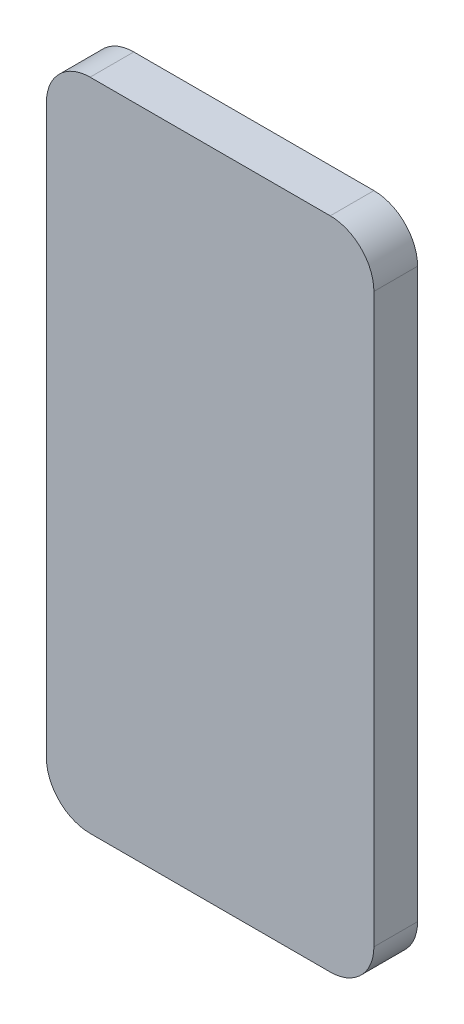
ISO-10303-21;
HEADER;
FILE_DESCRIPTION(('STEP AP214'),'2;1');
FILE_NAME('part.step','',(''),(''),'','','');
FILE_SCHEMA(('AUTOMOTIVE_DESIGN { 1 0 10303 214 1 1 1 1 }'));
ENDSEC;
DATA;
#1=APPLICATION_CONTEXT('core data for automotive mechanical design processes');
#2=APPLICATION_PROTOCOL_DEFINITION('international standard','automotive_design',2000,#1);
#3=PRODUCT_CONTEXT('',#1,'mechanical');
#4=PRODUCT('Part','Part','',(#3));
#5=PRODUCT_RELATED_PRODUCT_CATEGORY('part','',(#4));
#6=PRODUCT_DEFINITION_FORMATION('','',#4);
#7=PRODUCT_DEFINITION_CONTEXT('part definition',#1,'design');
#8=PRODUCT_DEFINITION('design','',#6,#7);
#9=PRODUCT_DEFINITION_SHAPE('','',#8);
#10=(LENGTH_UNIT() NAMED_UNIT(*) SI_UNIT(.MILLI.,.METRE.));
#11=(NAMED_UNIT(*) PLANE_ANGLE_UNIT() SI_UNIT($,.RADIAN.));
#12=(NAMED_UNIT(*) SI_UNIT($,.STERADIAN.) SOLID_ANGLE_UNIT());
#13=UNCERTAINTY_MEASURE_WITH_UNIT(LENGTH_MEASURE(1.E-05),#10,'distance_accuracy_value','');
#14=(GEOMETRIC_REPRESENTATION_CONTEXT(3) GLOBAL_UNCERTAINTY_ASSIGNED_CONTEXT((#13)) GLOBAL_UNIT_ASSIGNED_CONTEXT((#10,
#11,#12)) REPRESENTATION_CONTEXT('',''));
#15=CARTESIAN_POINT('',(0.,0.,0.));
#16=DIRECTION('',(0.,0.,1.));
#17=DIRECTION('',(1.,0.,0.));
#18=AXIS2_PLACEMENT_3D('',#15,#16,#17);
#19=CARTESIAN_POINT('',(0.,0.,10.));
#20=DIRECTION('',(1.,0.,0.));
#21=DIRECTION('',(0.,1.,0.));
#22=AXIS2_PLACEMENT_3D('',#19,#20,#21);
#23=PLANE('',#22);
#24=DIRECTION('',(0.,-1.,0.));
#25=VECTOR('',#24,1.);
#26=CARTESIAN_POINT('',(0.,0.,0.));
#27=LINE('',#26,#25);
#28=CARTESIAN_POINT('',(0.,140.,0.));
#29=VERTEX_POINT('',#28);
#30=CARTESIAN_POINT('',(0.,10.,0.));
#31=VERTEX_POINT('',#30);
#32=EDGE_CURVE('E136',#29,#31,#27,.T.);
#33=ORIENTED_EDGE('',*,*,#32,.T.);
#34=DIRECTION('',(0.,0.,-1.));
#35=VECTOR('',#34,1.);
#36=CARTESIAN_POINT('',(0.,10.,10.));
#37=LINE('',#36,#35);
#38=CARTESIAN_POINT('',(0.,10.,10.));
#39=VERTEX_POINT('',#38);
#40=EDGE_CURVE('E111',#31,#39,#37,.F.);
#41=ORIENTED_EDGE('',*,*,#40,.T.);
#42=DIRECTION('',(0.,-1.,0.));
#43=VECTOR('',#42,1.);
#44=CARTESIAN_POINT('',(0.,0.,10.));
#45=LINE('',#44,#43);
#46=CARTESIAN_POINT('',(0.,140.,10.));
#47=VERTEX_POINT('',#46);
#48=EDGE_CURVE('E148',#47,#39,#45,.T.);
#49=ORIENTED_EDGE('',*,*,#48,.F.);
#50=DIRECTION('',(0.,0.,-1.));
#51=VECTOR('',#50,1.);
#52=CARTESIAN_POINT('',(0.,140.,10.));
#53=LINE('',#52,#51);
#54=EDGE_CURVE('E117',#47,#29,#53,.T.);
#55=ORIENTED_EDGE('',*,*,#54,.T.);
#56=EDGE_LOOP('',(#33,#41,#49,#55));
#57=FACE_BOUND('',#56,.T.);
#58=ADVANCED_FACE('F39',(#57),#23,.F.);
#59=CARTESIAN_POINT('',(0.,0.,10.));
#60=DIRECTION('',(0.,1.,0.));
#61=DIRECTION('',(0.,0.,1.));
#62=AXIS2_PLACEMENT_3D('',#59,#60,#61);
#63=PLANE('',#62);
#64=DIRECTION('',(1.,0.,0.));
#65=VECTOR('',#64,1.);
#66=CARTESIAN_POINT('',(0.,0.,10.));
#67=LINE('',#66,#65);
#68=CARTESIAN_POINT('',(10.,0.,10.));
#69=VERTEX_POINT('',#68);
#70=CARTESIAN_POINT('',(65.,0.,10.));
#71=VERTEX_POINT('',#70);
#72=EDGE_CURVE('E127',#69,#71,#67,.T.);
#73=ORIENTED_EDGE('',*,*,#72,.F.);
#74=DIRECTION('',(0.,0.,-1.));
#75=VECTOR('',#74,1.);
#76=CARTESIAN_POINT('',(10.,0.,10.));
#77=LINE('',#76,#75);
#78=CARTESIAN_POINT('',(10.,0.,0.));
#79=VERTEX_POINT('',#78);
#80=EDGE_CURVE('E110',#69,#79,#77,.T.);
#81=ORIENTED_EDGE('',*,*,#80,.T.);
#82=DIRECTION('',(1.,0.,0.));
#83=VECTOR('',#82,1.);
#84=CARTESIAN_POINT('',(0.,0.,0.));
#85=LINE('',#84,#83);
#86=CARTESIAN_POINT('',(65.,0.,0.));
#87=VERTEX_POINT('',#86);
#88=EDGE_CURVE('E124',#79,#87,#85,.T.);
#89=ORIENTED_EDGE('',*,*,#88,.T.);
#90=DIRECTION('',(0.,0.,-1.));
#91=VECTOR('',#90,1.);
#92=CARTESIAN_POINT('',(65.,0.,10.));
#93=LINE('',#92,#91);
#94=EDGE_CURVE('E130',#87,#71,#93,.F.);
#95=ORIENTED_EDGE('',*,*,#94,.T.);
#96=EDGE_LOOP('',(#73,#81,#89,#95));
#97=FACE_BOUND('',#96,.T.);
#98=ADVANCED_FACE('F123',(#97),#63,.F.);
#99=CARTESIAN_POINT('',(75.,0.,10.));
#100=DIRECTION('',(-1.,0.,0.));
#101=DIRECTION('',(0.,-1.,0.));
#102=AXIS2_PLACEMENT_3D('',#99,#100,#101);
#103=PLANE('',#102);
#104=DIRECTION('',(0.,1.,0.));
#105=VECTOR('',#104,1.);
#106=CARTESIAN_POINT('',(75.,0.,10.));
#107=LINE('',#106,#105);
#108=CARTESIAN_POINT('',(75.,10.,10.));
#109=VERTEX_POINT('',#108);
#110=CARTESIAN_POINT('',(75.,140.,10.));
#111=VERTEX_POINT('',#110);
#112=EDGE_CURVE('E184',#109,#111,#107,.T.);
#113=ORIENTED_EDGE('',*,*,#112,.F.);
#114=DIRECTION('',(0.,0.,-1.));
#115=VECTOR('',#114,1.);
#116=CARTESIAN_POINT('',(75.,10.,10.));
#117=LINE('',#116,#115);
#118=CARTESIAN_POINT('',(75.,10.,0.));
#119=VERTEX_POINT('',#118);
#120=EDGE_CURVE('E178',#109,#119,#117,.T.);
#121=ORIENTED_EDGE('',*,*,#120,.T.);
#122=DIRECTION('',(0.,1.,0.));
#123=VECTOR('',#122,1.);
#124=CARTESIAN_POINT('',(75.,0.,0.));
#125=LINE('',#124,#123);
#126=CARTESIAN_POINT('',(75.,140.,0.));
#127=VERTEX_POINT('',#126);
#128=EDGE_CURVE('E135',#119,#127,#125,.T.);
#129=ORIENTED_EDGE('',*,*,#128,.T.);
#130=DIRECTION('',(0.,0.,-1.));
#131=VECTOR('',#130,1.);
#132=CARTESIAN_POINT('',(75.,140.,10.));
#133=LINE('',#132,#131);
#134=EDGE_CURVE('E175',#127,#111,#133,.F.);
#135=ORIENTED_EDGE('',*,*,#134,.T.);
#136=EDGE_LOOP('',(#113,#121,#129,#135));
#137=FACE_BOUND('',#136,.T.);
#138=ADVANCED_FACE('F205',(#137),#103,.F.);
#139=CARTESIAN_POINT('',(0.,150.,10.));
#140=DIRECTION('',(0.,-1.,0.));
#141=DIRECTION('',(0.,0.,-1.));
#142=AXIS2_PLACEMENT_3D('',#139,#140,#141);
#143=PLANE('',#142);
#144=DIRECTION('',(-1.,0.,0.));
#145=VECTOR('',#144,1.);
#146=CARTESIAN_POINT('',(0.,150.,10.));
#147=LINE('',#146,#145);
#148=CARTESIAN_POINT('',(65.,150.,10.));
#149=VERTEX_POINT('',#148);
#150=CARTESIAN_POINT('',(9.99999999999997,150.,10.));
#151=VERTEX_POINT('',#150);
#152=EDGE_CURVE('E150',#149,#151,#147,.T.);
#153=ORIENTED_EDGE('',*,*,#152,.F.);
#154=DIRECTION('',(0.,0.,-1.));
#155=VECTOR('',#154,1.);
#156=CARTESIAN_POINT('',(65.,150.,10.));
#157=LINE('',#156,#155);
#158=CARTESIAN_POINT('',(65.,150.,0.));
#159=VERTEX_POINT('',#158);
#160=EDGE_CURVE('E11',#149,#159,#157,.T.);
#161=ORIENTED_EDGE('',*,*,#160,.T.);
#162=DIRECTION('',(-1.,0.,0.));
#163=VECTOR('',#162,1.);
#164=CARTESIAN_POINT('',(0.,150.,0.));
#165=LINE('',#164,#163);
#166=CARTESIAN_POINT('',(9.99999999999997,150.,0.));
#167=VERTEX_POINT('',#166);
#168=EDGE_CURVE('E141',#159,#167,#165,.T.);
#169=ORIENTED_EDGE('',*,*,#168,.T.);
#170=DIRECTION('',(0.,0.,-1.));
#171=VECTOR('',#170,1.);
#172=CARTESIAN_POINT('',(9.99999999999997,150.,10.));
#173=LINE('',#172,#171);
#174=EDGE_CURVE('E48',#167,#151,#173,.F.);
#175=ORIENTED_EDGE('',*,*,#174,.T.);
#176=EDGE_LOOP('',(#153,#161,#169,#175));
#177=FACE_BOUND('',#176,.T.);
#178=ADVANCED_FACE('F198',(#177),#143,.F.);
#179=CARTESIAN_POINT('',(0.,0.,10.));
#180=DIRECTION('',(0.,0.,-1.));
#181=DIRECTION('',(-1.,0.,0.));
#182=AXIS2_PLACEMENT_3D('',#179,#180,#181);
#183=PLANE('',#182);
#184=ORIENTED_EDGE('',*,*,#48,.T.);
#185=CARTESIAN_POINT('',(10.,10.,10.));
#186=DIRECTION('',(0.,0.,-1.));
#187=DIRECTION('',(-1.,0.,0.));
#188=AXIS2_PLACEMENT_3D('',#185,#186,#187);
#189=CIRCLE('',#188,10.);
#190=EDGE_CURVE('E172',#39,#69,#189,.F.);
#191=ORIENTED_EDGE('',*,*,#190,.T.);
#192=ORIENTED_EDGE('',*,*,#72,.T.);
#193=CARTESIAN_POINT('',(65.,10.,10.));
#194=DIRECTION('',(0.,0.,-1.));
#195=DIRECTION('',(-1.,0.,0.));
#196=AXIS2_PLACEMENT_3D('',#193,#194,#195);
#197=CIRCLE('',#196,10.);
#198=EDGE_CURVE('E169',#71,#109,#197,.F.);
#199=ORIENTED_EDGE('',*,*,#198,.T.);
#200=ORIENTED_EDGE('',*,*,#112,.T.);
#201=CARTESIAN_POINT('',(65.,140.,10.));
#202=DIRECTION('',(0.,0.,-1.));
#203=DIRECTION('',(-1.,0.,0.));
#204=AXIS2_PLACEMENT_3D('',#201,#202,#203);
#205=CIRCLE('',#204,10.);
#206=EDGE_CURVE('E61',#111,#149,#205,.F.);
#207=ORIENTED_EDGE('',*,*,#206,.T.);
#208=ORIENTED_EDGE('',*,*,#152,.T.);
#209=CARTESIAN_POINT('',(9.99999999999997,140.,10.));
#210=DIRECTION('',(0.,0.,-1.));
#211=DIRECTION('',(-1.,0.,0.));
#212=AXIS2_PLACEMENT_3D('',#209,#210,#211);
#213=CIRCLE('',#212,10.);
#214=EDGE_CURVE('E164',#151,#47,#213,.F.);
#215=ORIENTED_EDGE('',*,*,#214,.T.);
#216=EDGE_LOOP('',(#184,#191,#192,#199,#200,#207,#208,#215));
#217=FACE_BOUND('',#216,.T.);
#218=ADVANCED_FACE('F192',(#217),#183,.F.);
#219=CARTESIAN_POINT('',(0.,0.,0.));
#220=DIRECTION('',(0.,0.,-1.));
#221=DIRECTION('',(-1.,0.,0.));
#222=AXIS2_PLACEMENT_3D('',#219,#220,#221);
#223=PLANE('',#222);
#224=ORIENTED_EDGE('',*,*,#88,.F.);
#225=CARTESIAN_POINT('',(10.,10.,0.));
#226=DIRECTION('',(0.,0.,-1.));
#227=DIRECTION('',(-1.,0.,0.));
#228=AXIS2_PLACEMENT_3D('',#225,#226,#227);
#229=CIRCLE('',#228,10.);
#230=EDGE_CURVE('E106',#79,#31,#229,.T.);
#231=ORIENTED_EDGE('',*,*,#230,.T.);
#232=ORIENTED_EDGE('',*,*,#32,.F.);
#233=CARTESIAN_POINT('',(9.99999999999997,140.,0.));
#234=DIRECTION('',(0.,0.,-1.));
#235=DIRECTION('',(-1.,0.,0.));
#236=AXIS2_PLACEMENT_3D('',#233,#234,#235);
#237=CIRCLE('',#236,10.);
#238=EDGE_CURVE('E129',#29,#167,#237,.T.);
#239=ORIENTED_EDGE('',*,*,#238,.T.);
#240=ORIENTED_EDGE('',*,*,#168,.F.);
#241=CARTESIAN_POINT('',(65.,140.,0.));
#242=DIRECTION('',(0.,0.,-1.));
#243=DIRECTION('',(-1.,0.,0.));
#244=AXIS2_PLACEMENT_3D('',#241,#242,#243);
#245=CIRCLE('',#244,10.);
#246=EDGE_CURVE('E154',#159,#127,#245,.T.);
#247=ORIENTED_EDGE('',*,*,#246,.T.);
#248=ORIENTED_EDGE('',*,*,#128,.F.);
#249=CARTESIAN_POINT('',(65.,10.,0.));
#250=DIRECTION('',(0.,0.,-1.));
#251=DIRECTION('',(-1.,0.,0.));
#252=AXIS2_PLACEMENT_3D('',#249,#250,#251);
#253=CIRCLE('',#252,10.);
#254=EDGE_CURVE('E118',#119,#87,#253,.T.);
#255=ORIENTED_EDGE('',*,*,#254,.T.);
#256=EDGE_LOOP('',(#224,#231,#232,#239,#240,#247,#248,#255));
#257=FACE_BOUND('',#256,.T.);
#258=ADVANCED_FACE('F132',(#257),#223,.T.);
#259=CARTESIAN_POINT('',(10.,10.,10.));
#260=DIRECTION('',(0.,0.,-1.));
#261=DIRECTION('',(-1.,0.,0.));
#262=AXIS2_PLACEMENT_3D('',#259,#260,#261);
#263=CYLINDRICAL_SURFACE('',#262,10.);
#264=ORIENTED_EDGE('',*,*,#190,.F.);
#265=ORIENTED_EDGE('',*,*,#40,.F.);
#266=ORIENTED_EDGE('',*,*,#230,.F.);
#267=ORIENTED_EDGE('',*,*,#80,.F.);
#268=EDGE_LOOP('',(#264,#265,#266,#267));
#269=FACE_BOUND('',#268,.T.);
#270=ADVANCED_FACE('F109',(#269),#263,.T.);
#271=CARTESIAN_POINT('',(65.,10.,10.));
#272=DIRECTION('',(0.,0.,-1.));
#273=DIRECTION('',(-1.,0.,0.));
#274=AXIS2_PLACEMENT_3D('',#271,#272,#273);
#275=CYLINDRICAL_SURFACE('',#274,10.);
#276=ORIENTED_EDGE('',*,*,#198,.F.);
#277=ORIENTED_EDGE('',*,*,#94,.F.);
#278=ORIENTED_EDGE('',*,*,#254,.F.);
#279=ORIENTED_EDGE('',*,*,#120,.F.);
#280=EDGE_LOOP('',(#276,#277,#278,#279));
#281=FACE_BOUND('',#280,.T.);
#282=ADVANCED_FACE('F209',(#281),#275,.T.);
#283=CARTESIAN_POINT('',(65.,140.,10.));
#284=DIRECTION('',(0.,0.,-1.));
#285=DIRECTION('',(-1.,0.,0.));
#286=AXIS2_PLACEMENT_3D('',#283,#284,#285);
#287=CYLINDRICAL_SURFACE('',#286,10.);
#288=ORIENTED_EDGE('',*,*,#206,.F.);
#289=ORIENTED_EDGE('',*,*,#134,.F.);
#290=ORIENTED_EDGE('',*,*,#246,.F.);
#291=ORIENTED_EDGE('',*,*,#160,.F.);
#292=EDGE_LOOP('',(#288,#289,#290,#291));
#293=FACE_BOUND('',#292,.T.);
#294=ADVANCED_FACE('F201',(#293),#287,.T.);
#295=CARTESIAN_POINT('',(9.99999999999997,140.,10.));
#296=DIRECTION('',(0.,0.,-1.));
#297=DIRECTION('',(-1.,0.,0.));
#298=AXIS2_PLACEMENT_3D('',#295,#296,#297);
#299=CYLINDRICAL_SURFACE('',#298,10.);
#300=ORIENTED_EDGE('',*,*,#214,.F.);
#301=ORIENTED_EDGE('',*,*,#174,.F.);
#302=ORIENTED_EDGE('',*,*,#238,.F.);
#303=ORIENTED_EDGE('',*,*,#54,.F.);
#304=EDGE_LOOP('',(#300,#301,#302,#303));
#305=FACE_BOUND('',#304,.T.);
#306=ADVANCED_FACE('F41',(#305),#299,.T.);
#307=CLOSED_SHELL('',(#58,#98,#138,#178,#218,#258,#270,#282,#294,#306));
#308=MANIFOLD_SOLID_BREP('B2',#307);
#309=ADVANCED_BREP_SHAPE_REPRESENTATION('',(#18,#308),#14);
#310=SHAPE_DEFINITION_REPRESENTATION(#9,#309);
ENDSEC;
END-ISO-10303-21;
